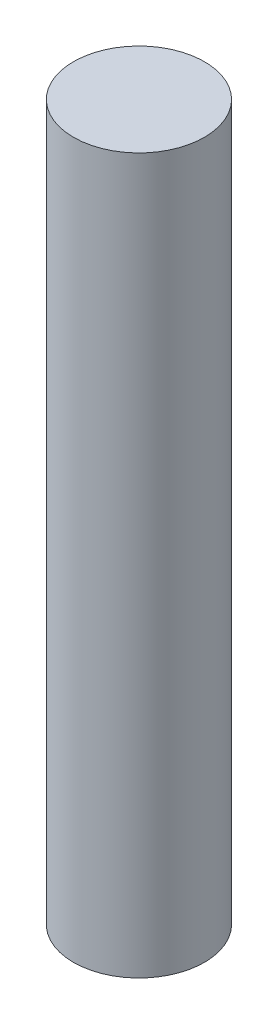
ISO-10303-21;
HEADER;
FILE_DESCRIPTION(('STEP AP214'),'2;1');
FILE_NAME('part.step','',(''),(''),'','','');
FILE_SCHEMA(('AUTOMOTIVE_DESIGN { 1 0 10303 214 1 1 1 1 }'));
ENDSEC;
DATA;
#1=APPLICATION_CONTEXT('core data for automotive mechanical design processes');
#2=APPLICATION_PROTOCOL_DEFINITION('international standard','automotive_design',2000,#1);
#3=PRODUCT_CONTEXT('',#1,'mechanical');
#4=PRODUCT('Part','Part','',(#3));
#5=PRODUCT_RELATED_PRODUCT_CATEGORY('part','',(#4));
#6=PRODUCT_DEFINITION_FORMATION('','',#4);
#7=PRODUCT_DEFINITION_CONTEXT('part definition',#1,'design');
#8=PRODUCT_DEFINITION('design','',#6,#7);
#9=PRODUCT_DEFINITION_SHAPE('','',#8);
#10=(LENGTH_UNIT() NAMED_UNIT(*) SI_UNIT(.MILLI.,.METRE.));
#11=(NAMED_UNIT(*) PLANE_ANGLE_UNIT() SI_UNIT($,.RADIAN.));
#12=(NAMED_UNIT(*) SI_UNIT($,.STERADIAN.) SOLID_ANGLE_UNIT());
#13=UNCERTAINTY_MEASURE_WITH_UNIT(LENGTH_MEASURE(1.E-05),#10,'distance_accuracy_value','');
#14=(GEOMETRIC_REPRESENTATION_CONTEXT(3) GLOBAL_UNCERTAINTY_ASSIGNED_CONTEXT((#13)) GLOBAL_UNIT_ASSIGNED_CONTEXT((#10,
#11,#12)) REPRESENTATION_CONTEXT('',''));
#15=CARTESIAN_POINT('',(0.,0.,0.));
#16=DIRECTION('',(0.,0.,1.));
#17=DIRECTION('',(1.,0.,0.));
#18=AXIS2_PLACEMENT_3D('',#15,#16,#17);
#19=CARTESIAN_POINT('',(0.,60.,0.));
#20=DIRECTION('',(0.,-1.,0.));
#21=DIRECTION('',(0.,0.,-1.));
#22=AXIS2_PLACEMENT_3D('',#19,#20,#21);
#23=CYLINDRICAL_SURFACE('',#22,5.5);
#24=CARTESIAN_POINT('',(0.,60.,0.));
#25=DIRECTION('',(0.,1.,0.));
#26=DIRECTION('',(0.,0.,1.));
#27=AXIS2_PLACEMENT_3D('',#24,#25,#26);
#28=CIRCLE('',#27,5.5);
#29=CARTESIAN_POINT('',(0.,60.,5.5));
#30=VERTEX_POINT('',#29);
#31=EDGE_CURVE('E10',#30,#30,#28,.T.);
#32=ORIENTED_EDGE('',*,*,#31,.F.);
#33=EDGE_LOOP('',(#32));
#34=FACE_BOUND('',#33,.T.);
#35=CARTESIAN_POINT('',(0.,0.,0.));
#36=DIRECTION('',(0.,1.,0.));
#37=DIRECTION('',(0.,0.,1.));
#38=AXIS2_PLACEMENT_3D('',#35,#36,#37);
#39=CIRCLE('',#38,5.5);
#40=CARTESIAN_POINT('',(0.,0.,5.5));
#41=VERTEX_POINT('',#40);
#42=EDGE_CURVE('E40',#41,#41,#39,.T.);
#43=ORIENTED_EDGE('',*,*,#42,.T.);
#44=EDGE_LOOP('',(#43));
#45=FACE_BOUND('',#44,.T.);
#46=ADVANCED_FACE('F37',(#34,#45),#23,.T.);
#47=CARTESIAN_POINT('',(0.,60.,0.));
#48=DIRECTION('',(0.,1.,0.));
#49=DIRECTION('',(0.,0.,1.));
#50=AXIS2_PLACEMENT_3D('',#47,#48,#49);
#51=PLANE('',#50);
#52=ORIENTED_EDGE('',*,*,#31,.T.);
#53=EDGE_LOOP('',(#52));
#54=FACE_BOUND('',#53,.T.);
#55=ADVANCED_FACE('F52',(#54),#51,.T.);
#56=CARTESIAN_POINT('',(0.,0.,0.));
#57=DIRECTION('',(0.,1.,0.));
#58=DIRECTION('',(0.,0.,1.));
#59=AXIS2_PLACEMENT_3D('',#56,#57,#58);
#60=PLANE('',#59);
#61=ORIENTED_EDGE('',*,*,#42,.F.);
#62=EDGE_LOOP('',(#61));
#63=FACE_BOUND('',#62,.T.);
#64=ADVANCED_FACE('F50',(#63),#60,.F.);
#65=CLOSED_SHELL('',(#46,#55,#64));
#66=MANIFOLD_SOLID_BREP('B2',#65);
#67=ADVANCED_BREP_SHAPE_REPRESENTATION('',(#18,#66),#14);
#68=SHAPE_DEFINITION_REPRESENTATION(#9,#67);
ENDSEC;
END-ISO-10303-21;
